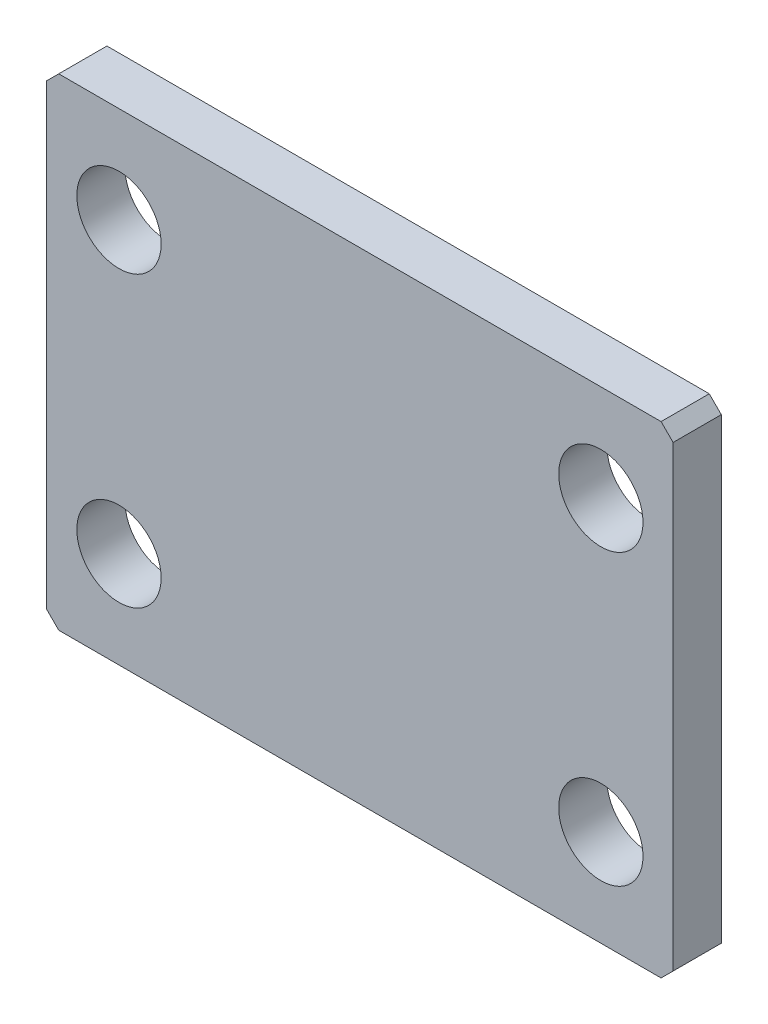
ISO-10303-21;
HEADER;
FILE_DESCRIPTION(('STEP AP214'),'2;1');
FILE_NAME('part.step','',(''),(''),'','','');
FILE_SCHEMA(('AUTOMOTIVE_DESIGN { 1 0 10303 214 1 1 1 1 }'));
ENDSEC;
DATA;
#1=APPLICATION_CONTEXT('core data for automotive mechanical design processes');
#2=APPLICATION_PROTOCOL_DEFINITION('international standard','automotive_design',2000,#1);
#3=PRODUCT_CONTEXT('',#1,'mechanical');
#4=PRODUCT('Part','Part','',(#3));
#5=PRODUCT_RELATED_PRODUCT_CATEGORY('part','',(#4));
#6=PRODUCT_DEFINITION_FORMATION('','',#4);
#7=PRODUCT_DEFINITION_CONTEXT('part definition',#1,'design');
#8=PRODUCT_DEFINITION('design','',#6,#7);
#9=PRODUCT_DEFINITION_SHAPE('','',#8);
#10=(LENGTH_UNIT() NAMED_UNIT(*) SI_UNIT(.MILLI.,.METRE.));
#11=(NAMED_UNIT(*) PLANE_ANGLE_UNIT() SI_UNIT($,.RADIAN.));
#12=(NAMED_UNIT(*) SI_UNIT($,.STERADIAN.) SOLID_ANGLE_UNIT());
#13=UNCERTAINTY_MEASURE_WITH_UNIT(LENGTH_MEASURE(1.E-05),#10,'distance_accuracy_value','');
#14=(GEOMETRIC_REPRESENTATION_CONTEXT(3) GLOBAL_UNCERTAINTY_ASSIGNED_CONTEXT((#13)) GLOBAL_UNIT_ASSIGNED_CONTEXT((#10,
#11,#12)) REPRESENTATION_CONTEXT('',''));
#15=CARTESIAN_POINT('',(0.,0.,0.));
#16=DIRECTION('',(0.,0.,1.));
#17=DIRECTION('',(1.,0.,0.));
#18=AXIS2_PLACEMENT_3D('',#15,#16,#17);
#19=CARTESIAN_POINT('',(-26.,39.,4.));
#20=DIRECTION('',(0.707106781186545,-0.70710678118655,0.));
#21=DIRECTION('',(0.70710678118655,0.707106781186545,0.));
#22=AXIS2_PLACEMENT_3D('',#19,#20,#21);
#23=PLANE('',#22);
#24=DIRECTION('',(-0.70710678118655,-0.707106781186545,0.));
#25=VECTOR('',#24,1.);
#26=CARTESIAN_POINT('',(-26.,39.,0.));
#27=LINE('',#26,#25);
#28=CARTESIAN_POINT('',(-25.,40.,0.));
#29=VERTEX_POINT('',#28);
#30=CARTESIAN_POINT('',(-26.,39.,0.));
#31=VERTEX_POINT('',#30);
#32=EDGE_CURVE('E129',#29,#31,#27,.T.);
#33=ORIENTED_EDGE('',*,*,#32,.T.);
#34=DIRECTION('',(0.,0.,-1.));
#35=VECTOR('',#34,1.);
#36=CARTESIAN_POINT('',(-26.,39.,4.));
#37=LINE('',#36,#35);
#38=CARTESIAN_POINT('',(-26.,39.,4.));
#39=VERTEX_POINT('',#38);
#40=EDGE_CURVE('E11',#39,#31,#37,.T.);
#41=ORIENTED_EDGE('',*,*,#40,.F.);
#42=DIRECTION('',(-0.70710678118655,-0.707106781186545,0.));
#43=VECTOR('',#42,1.);
#44=CARTESIAN_POINT('',(-26.,39.,4.));
#45=LINE('',#44,#43);
#46=CARTESIAN_POINT('',(-25.,40.,4.));
#47=VERTEX_POINT('',#46);
#48=EDGE_CURVE('E144',#47,#39,#45,.T.);
#49=ORIENTED_EDGE('',*,*,#48,.F.);
#50=DIRECTION('',(0.,0.,-1.));
#51=VECTOR('',#50,1.);
#52=CARTESIAN_POINT('',(-25.,40.,4.));
#53=LINE('',#52,#51);
#54=EDGE_CURVE('E125',#47,#29,#53,.T.);
#55=ORIENTED_EDGE('',*,*,#54,.T.);
#56=EDGE_LOOP('',(#33,#41,#49,#55));
#57=FACE_BOUND('',#56,.T.);
#58=ADVANCED_FACE('F33',(#57),#23,.F.);
#59=CARTESIAN_POINT('',(-26.,1.,4.));
#60=DIRECTION('',(1.,0.,0.));
#61=DIRECTION('',(0.,0.,-1.));
#62=AXIS2_PLACEMENT_3D('',#59,#60,#61);
#63=PLANE('',#62);
#64=DIRECTION('',(0.,-1.,0.));
#65=VECTOR('',#64,1.);
#66=CARTESIAN_POINT('',(-26.,1.,0.));
#67=LINE('',#66,#65);
#68=CARTESIAN_POINT('',(-26.,1.,0.));
#69=VERTEX_POINT('',#68);
#70=EDGE_CURVE('E132',#31,#69,#67,.T.);
#71=ORIENTED_EDGE('',*,*,#70,.T.);
#72=DIRECTION('',(0.,0.,-1.));
#73=VECTOR('',#72,1.);
#74=CARTESIAN_POINT('',(-26.,1.,4.));
#75=LINE('',#74,#73);
#76=CARTESIAN_POINT('',(-26.,1.,4.));
#77=VERTEX_POINT('',#76);
#78=EDGE_CURVE('E41',#77,#69,#75,.T.);
#79=ORIENTED_EDGE('',*,*,#78,.F.);
#80=DIRECTION('',(0.,-1.,0.));
#81=VECTOR('',#80,1.);
#82=CARTESIAN_POINT('',(-26.,1.,4.));
#83=LINE('',#82,#81);
#84=EDGE_CURVE('E92',#39,#77,#83,.T.);
#85=ORIENTED_EDGE('',*,*,#84,.F.);
#86=ORIENTED_EDGE('',*,*,#40,.T.);
#87=EDGE_LOOP('',(#71,#79,#85,#86));
#88=FACE_BOUND('',#87,.T.);
#89=ADVANCED_FACE('F229',(#88),#63,.F.);
#90=CARTESIAN_POINT('',(-25.,0.,4.));
#91=DIRECTION('',(0.707106781186547,0.707106781186548,0.));
#92=DIRECTION('',(-0.707106781186548,0.707106781186547,0.));
#93=AXIS2_PLACEMENT_3D('',#90,#91,#92);
#94=PLANE('',#93);
#95=DIRECTION('',(0.707106781186548,-0.707106781186547,0.));
#96=VECTOR('',#95,1.);
#97=CARTESIAN_POINT('',(-25.,0.,0.));
#98=LINE('',#97,#96);
#99=CARTESIAN_POINT('',(-25.,0.,0.));
#100=VERTEX_POINT('',#99);
#101=EDGE_CURVE('E135',#69,#100,#98,.T.);
#102=ORIENTED_EDGE('',*,*,#101,.T.);
#103=DIRECTION('',(0.,0.,-1.));
#104=VECTOR('',#103,1.);
#105=CARTESIAN_POINT('',(-25.,0.,4.));
#106=LINE('',#105,#104);
#107=CARTESIAN_POINT('',(-25.,0.,4.));
#108=VERTEX_POINT('',#107);
#109=EDGE_CURVE('E151',#108,#100,#106,.T.);
#110=ORIENTED_EDGE('',*,*,#109,.F.);
#111=DIRECTION('',(0.707106781186548,-0.707106781186547,0.));
#112=VECTOR('',#111,1.);
#113=CARTESIAN_POINT('',(-25.,0.,4.));
#114=LINE('',#113,#112);
#115=EDGE_CURVE('E159',#77,#108,#114,.T.);
#116=ORIENTED_EDGE('',*,*,#115,.F.);
#117=ORIENTED_EDGE('',*,*,#78,.T.);
#118=EDGE_LOOP('',(#102,#110,#116,#117));
#119=FACE_BOUND('',#118,.T.);
#120=ADVANCED_FACE('F157',(#119),#94,.F.);
#121=CARTESIAN_POINT('',(-25.,0.,4.));
#122=DIRECTION('',(0.,1.,0.));
#123=DIRECTION('',(0.,0.,1.));
#124=AXIS2_PLACEMENT_3D('',#121,#122,#123);
#125=PLANE('',#124);
#126=DIRECTION('',(1.,0.,0.));
#127=VECTOR('',#126,1.);
#128=CARTESIAN_POINT('',(-25.,0.,0.));
#129=LINE('',#128,#127);
#130=CARTESIAN_POINT('',(25.,0.,0.));
#131=VERTEX_POINT('',#130);
#132=EDGE_CURVE('E137',#100,#131,#129,.T.);
#133=ORIENTED_EDGE('',*,*,#132,.T.);
#134=DIRECTION('',(0.,0.,-1.));
#135=VECTOR('',#134,1.);
#136=CARTESIAN_POINT('',(25.,0.,4.));
#137=LINE('',#136,#135);
#138=CARTESIAN_POINT('',(25.,0.,4.));
#139=VERTEX_POINT('',#138);
#140=EDGE_CURVE('E148',#139,#131,#137,.T.);
#141=ORIENTED_EDGE('',*,*,#140,.F.);
#142=DIRECTION('',(1.,0.,0.));
#143=VECTOR('',#142,1.);
#144=CARTESIAN_POINT('',(-25.,0.,4.));
#145=LINE('',#144,#143);
#146=EDGE_CURVE('E171',#108,#139,#145,.T.);
#147=ORIENTED_EDGE('',*,*,#146,.F.);
#148=ORIENTED_EDGE('',*,*,#109,.T.);
#149=EDGE_LOOP('',(#133,#141,#147,#148));
#150=FACE_BOUND('',#149,.T.);
#151=ADVANCED_FACE('F167',(#150),#125,.F.);
#152=CARTESIAN_POINT('',(26.,1.,4.));
#153=DIRECTION('',(-0.707106781186557,0.707106781186538,0.));
#154=DIRECTION('',(-0.707106781186538,-0.707106781186557,0.));
#155=AXIS2_PLACEMENT_3D('',#152,#153,#154);
#156=PLANE('',#155);
#157=DIRECTION('',(0.707106781186538,0.707106781186557,0.));
#158=VECTOR('',#157,1.);
#159=CARTESIAN_POINT('',(26.,1.,0.));
#160=LINE('',#159,#158);
#161=CARTESIAN_POINT('',(26.,1.,0.));
#162=VERTEX_POINT('',#161);
#163=EDGE_CURVE('E139',#131,#162,#160,.T.);
#164=ORIENTED_EDGE('',*,*,#163,.T.);
#165=DIRECTION('',(0.,0.,-1.));
#166=VECTOR('',#165,1.);
#167=CARTESIAN_POINT('',(26.,1.,4.));
#168=LINE('',#167,#166);
#169=CARTESIAN_POINT('',(26.,1.,4.));
#170=VERTEX_POINT('',#169);
#171=EDGE_CURVE('E120',#170,#162,#168,.T.);
#172=ORIENTED_EDGE('',*,*,#171,.F.);
#173=DIRECTION('',(0.707106781186538,0.707106781186557,0.));
#174=VECTOR('',#173,1.);
#175=CARTESIAN_POINT('',(26.,1.,4.));
#176=LINE('',#175,#174);
#177=EDGE_CURVE('E111',#139,#170,#176,.T.);
#178=ORIENTED_EDGE('',*,*,#177,.F.);
#179=ORIENTED_EDGE('',*,*,#140,.T.);
#180=EDGE_LOOP('',(#164,#172,#178,#179));
#181=FACE_BOUND('',#180,.T.);
#182=ADVANCED_FACE('F170',(#181),#156,.F.);
#183=CARTESIAN_POINT('',(26.,1.,4.));
#184=DIRECTION('',(-1.,0.,0.));
#185=DIRECTION('',(0.,-1.,0.));
#186=AXIS2_PLACEMENT_3D('',#183,#184,#185);
#187=PLANE('',#186);
#188=DIRECTION('',(0.,1.,0.));
#189=VECTOR('',#188,1.);
#190=CARTESIAN_POINT('',(26.,1.,0.));
#191=LINE('',#190,#189);
#192=CARTESIAN_POINT('',(26.,39.,0.));
#193=VERTEX_POINT('',#192);
#194=EDGE_CURVE('E119',#162,#193,#191,.T.);
#195=ORIENTED_EDGE('',*,*,#194,.T.);
#196=DIRECTION('',(0.,0.,-1.));
#197=VECTOR('',#196,1.);
#198=CARTESIAN_POINT('',(26.,39.,4.));
#199=LINE('',#198,#197);
#200=CARTESIAN_POINT('',(26.,39.,4.));
#201=VERTEX_POINT('',#200);
#202=EDGE_CURVE('E116',#201,#193,#199,.T.);
#203=ORIENTED_EDGE('',*,*,#202,.F.);
#204=DIRECTION('',(0.,1.,0.));
#205=VECTOR('',#204,1.);
#206=CARTESIAN_POINT('',(26.,1.,4.));
#207=LINE('',#206,#205);
#208=EDGE_CURVE('E105',#170,#201,#207,.T.);
#209=ORIENTED_EDGE('',*,*,#208,.F.);
#210=ORIENTED_EDGE('',*,*,#171,.T.);
#211=EDGE_LOOP('',(#195,#203,#209,#210));
#212=FACE_BOUND('',#211,.T.);
#213=ADVANCED_FACE('F117',(#212),#187,.F.);
#214=CARTESIAN_POINT('',(25.,40.,4.));
#215=DIRECTION('',(-0.707106781186552,-0.707106781186543,0.));
#216=DIRECTION('',(0.707106781186543,-0.707106781186552,0.));
#217=AXIS2_PLACEMENT_3D('',#214,#215,#216);
#218=PLANE('',#217);
#219=DIRECTION('',(-0.707106781186543,0.707106781186552,0.));
#220=VECTOR('',#219,1.);
#221=CARTESIAN_POINT('',(25.,40.,0.));
#222=LINE('',#221,#220);
#223=CARTESIAN_POINT('',(25.,40.,0.));
#224=VERTEX_POINT('',#223);
#225=EDGE_CURVE('E78',#193,#224,#222,.T.);
#226=ORIENTED_EDGE('',*,*,#225,.T.);
#227=DIRECTION('',(0.,0.,-1.));
#228=VECTOR('',#227,1.);
#229=CARTESIAN_POINT('',(25.,40.,4.));
#230=LINE('',#229,#228);
#231=CARTESIAN_POINT('',(25.,40.,4.));
#232=VERTEX_POINT('',#231);
#233=EDGE_CURVE('E121',#232,#224,#230,.T.);
#234=ORIENTED_EDGE('',*,*,#233,.F.);
#235=DIRECTION('',(-0.707106781186543,0.707106781186552,0.));
#236=VECTOR('',#235,1.);
#237=CARTESIAN_POINT('',(25.,40.,4.));
#238=LINE('',#237,#236);
#239=EDGE_CURVE('E109',#201,#232,#238,.T.);
#240=ORIENTED_EDGE('',*,*,#239,.F.);
#241=ORIENTED_EDGE('',*,*,#202,.T.);
#242=EDGE_LOOP('',(#226,#234,#240,#241));
#243=FACE_BOUND('',#242,.T.);
#244=ADVANCED_FACE('F123',(#243),#218,.F.);
#245=CARTESIAN_POINT('',(-25.,40.,4.));
#246=DIRECTION('',(0.,-1.,0.));
#247=DIRECTION('',(0.,0.,-1.));
#248=AXIS2_PLACEMENT_3D('',#245,#246,#247);
#249=PLANE('',#248);
#250=DIRECTION('',(-1.,0.,0.));
#251=VECTOR('',#250,1.);
#252=CARTESIAN_POINT('',(-25.,40.,0.));
#253=LINE('',#252,#251);
#254=EDGE_CURVE('E84',#224,#29,#253,.T.);
#255=ORIENTED_EDGE('',*,*,#254,.T.);
#256=ORIENTED_EDGE('',*,*,#54,.F.);
#257=DIRECTION('',(-1.,0.,0.));
#258=VECTOR('',#257,1.);
#259=CARTESIAN_POINT('',(-25.,40.,4.));
#260=LINE('',#259,#258);
#261=EDGE_CURVE('E49',#232,#47,#260,.T.);
#262=ORIENTED_EDGE('',*,*,#261,.F.);
#263=ORIENTED_EDGE('',*,*,#233,.T.);
#264=EDGE_LOOP('',(#255,#256,#262,#263));
#265=FACE_BOUND('',#264,.T.);
#266=ADVANCED_FACE('F213',(#265),#249,.F.);
#267=CARTESIAN_POINT('',(0.,0.,4.));
#268=DIRECTION('',(0.,0.,-1.));
#269=DIRECTION('',(-1.,0.,0.));
#270=AXIS2_PLACEMENT_3D('',#267,#268,#269);
#271=PLANE('',#270);
#272=CARTESIAN_POINT('',(-20.,32.,4.));
#273=DIRECTION('',(0.,0.,1.));
#274=DIRECTION('',(1.,0.,0.));
#275=AXIS2_PLACEMENT_3D('',#272,#273,#274);
#276=CIRCLE('',#275,3.5);
#277=CARTESIAN_POINT('',(-16.5,32.,4.));
#278=VERTEX_POINT('',#277);
#279=EDGE_CURVE('E190',#278,#278,#276,.T.);
#280=ORIENTED_EDGE('',*,*,#279,.F.);
#281=EDGE_LOOP('',(#280));
#282=FACE_BOUND('',#281,.T.);
#283=CARTESIAN_POINT('',(20.,8.,4.));
#284=DIRECTION('',(0.,0.,1.));
#285=DIRECTION('',(1.,0.,0.));
#286=AXIS2_PLACEMENT_3D('',#283,#284,#285);
#287=CIRCLE('',#286,3.5);
#288=CARTESIAN_POINT('',(23.5,8.,4.));
#289=VERTEX_POINT('',#288);
#290=EDGE_CURVE('E183',#289,#289,#287,.T.);
#291=ORIENTED_EDGE('',*,*,#290,.F.);
#292=EDGE_LOOP('',(#291));
#293=FACE_BOUND('',#292,.T.);
#294=CARTESIAN_POINT('',(-20.,8.,4.));
#295=DIRECTION('',(0.,0.,1.));
#296=DIRECTION('',(1.,0.,0.));
#297=AXIS2_PLACEMENT_3D('',#294,#295,#296);
#298=CIRCLE('',#297,3.5);
#299=CARTESIAN_POINT('',(-16.5,8.,4.));
#300=VERTEX_POINT('',#299);
#301=EDGE_CURVE('E195',#300,#300,#298,.T.);
#302=ORIENTED_EDGE('',*,*,#301,.F.);
#303=EDGE_LOOP('',(#302));
#304=FACE_BOUND('',#303,.T.);
#305=CARTESIAN_POINT('',(20.,32.,4.));
#306=DIRECTION('',(0.,0.,1.));
#307=DIRECTION('',(1.,0.,0.));
#308=AXIS2_PLACEMENT_3D('',#305,#306,#307);
#309=CIRCLE('',#308,3.5);
#310=CARTESIAN_POINT('',(23.5,32.,4.));
#311=VERTEX_POINT('',#310);
#312=EDGE_CURVE('E177',#311,#311,#309,.T.);
#313=ORIENTED_EDGE('',*,*,#312,.F.);
#314=EDGE_LOOP('',(#313));
#315=FACE_BOUND('',#314,.T.);
#316=ORIENTED_EDGE('',*,*,#48,.T.);
#317=ORIENTED_EDGE('',*,*,#84,.T.);
#318=ORIENTED_EDGE('',*,*,#115,.T.);
#319=ORIENTED_EDGE('',*,*,#146,.T.);
#320=ORIENTED_EDGE('',*,*,#177,.T.);
#321=ORIENTED_EDGE('',*,*,#208,.T.);
#322=ORIENTED_EDGE('',*,*,#239,.T.);
#323=ORIENTED_EDGE('',*,*,#261,.T.);
#324=EDGE_LOOP('',(#316,#317,#318,#319,#320,#321,#322,#323));
#325=FACE_BOUND('',#324,.T.);
#326=ADVANCED_FACE('F107',(#282,#293,#304,#315,#325),#271,.F.);
#327=CARTESIAN_POINT('',(0.,0.,0.));
#328=DIRECTION('',(0.,0.,-1.));
#329=DIRECTION('',(-1.,0.,0.));
#330=AXIS2_PLACEMENT_3D('',#327,#328,#329);
#331=PLANE('',#330);
#332=CARTESIAN_POINT('',(-20.,32.,0.));
#333=DIRECTION('',(0.,0.,1.));
#334=DIRECTION('',(1.,0.,0.));
#335=AXIS2_PLACEMENT_3D('',#332,#333,#334);
#336=CIRCLE('',#335,3.5);
#337=CARTESIAN_POINT('',(-16.5,32.,0.));
#338=VERTEX_POINT('',#337);
#339=EDGE_CURVE('E180',#338,#338,#336,.T.);
#340=ORIENTED_EDGE('',*,*,#339,.T.);
#341=EDGE_LOOP('',(#340));
#342=FACE_BOUND('',#341,.T.);
#343=CARTESIAN_POINT('',(20.,8.,0.));
#344=DIRECTION('',(0.,0.,1.));
#345=DIRECTION('',(1.,0.,0.));
#346=AXIS2_PLACEMENT_3D('',#343,#344,#345);
#347=CIRCLE('',#346,3.5);
#348=CARTESIAN_POINT('',(23.5,8.,0.));
#349=VERTEX_POINT('',#348);
#350=EDGE_CURVE('E186',#349,#349,#347,.T.);
#351=ORIENTED_EDGE('',*,*,#350,.T.);
#352=EDGE_LOOP('',(#351));
#353=FACE_BOUND('',#352,.T.);
#354=CARTESIAN_POINT('',(-20.,8.,0.));
#355=DIRECTION('',(0.,0.,1.));
#356=DIRECTION('',(1.,0.,0.));
#357=AXIS2_PLACEMENT_3D('',#354,#355,#356);
#358=CIRCLE('',#357,3.5);
#359=CARTESIAN_POINT('',(-16.5,8.,0.));
#360=VERTEX_POINT('',#359);
#361=EDGE_CURVE('E187',#360,#360,#358,.T.);
#362=ORIENTED_EDGE('',*,*,#361,.T.);
#363=EDGE_LOOP('',(#362));
#364=FACE_BOUND('',#363,.T.);
#365=CARTESIAN_POINT('',(20.,32.,0.));
#366=DIRECTION('',(0.,0.,1.));
#367=DIRECTION('',(1.,0.,0.));
#368=AXIS2_PLACEMENT_3D('',#365,#366,#367);
#369=CIRCLE('',#368,3.5);
#370=CARTESIAN_POINT('',(23.5,32.,0.));
#371=VERTEX_POINT('',#370);
#372=EDGE_CURVE('E133',#371,#371,#369,.T.);
#373=ORIENTED_EDGE('',*,*,#372,.T.);
#374=EDGE_LOOP('',(#373));
#375=FACE_BOUND('',#374,.T.);
#376=ORIENTED_EDGE('',*,*,#32,.F.);
#377=ORIENTED_EDGE('',*,*,#254,.F.);
#378=ORIENTED_EDGE('',*,*,#225,.F.);
#379=ORIENTED_EDGE('',*,*,#194,.F.);
#380=ORIENTED_EDGE('',*,*,#163,.F.);
#381=ORIENTED_EDGE('',*,*,#132,.F.);
#382=ORIENTED_EDGE('',*,*,#101,.F.);
#383=ORIENTED_EDGE('',*,*,#70,.F.);
#384=EDGE_LOOP('',(#376,#377,#378,#379,#380,#381,#382,#383));
#385=FACE_BOUND('',#384,.T.);
#386=ADVANCED_FACE('F163',(#342,#353,#364,#375,#385),#331,.T.);
#387=CARTESIAN_POINT('',(20.,32.,0.));
#388=DIRECTION('',(0.,0.,1.));
#389=DIRECTION('',(1.,0.,0.));
#390=AXIS2_PLACEMENT_3D('',#387,#388,#389);
#391=CYLINDRICAL_SURFACE('',#390,3.5);
#392=ORIENTED_EDGE('',*,*,#372,.F.);
#393=EDGE_LOOP('',(#392));
#394=FACE_BOUND('',#393,.T.);
#395=ORIENTED_EDGE('',*,*,#312,.T.);
#396=EDGE_LOOP('',(#395));
#397=FACE_BOUND('',#396,.T.);
#398=ADVANCED_FACE('F207',(#394,#397),#391,.F.);
#399=CARTESIAN_POINT('',(-20.,8.,0.));
#400=DIRECTION('',(0.,0.,1.));
#401=DIRECTION('',(1.,0.,0.));
#402=AXIS2_PLACEMENT_3D('',#399,#400,#401);
#403=CYLINDRICAL_SURFACE('',#402,3.5);
#404=ORIENTED_EDGE('',*,*,#361,.F.);
#405=EDGE_LOOP('',(#404));
#406=FACE_BOUND('',#405,.T.);
#407=ORIENTED_EDGE('',*,*,#301,.T.);
#408=EDGE_LOOP('',(#407));
#409=FACE_BOUND('',#408,.T.);
#410=ADVANCED_FACE('F203',(#406,#409),#403,.F.);
#411=CARTESIAN_POINT('',(20.,8.,0.));
#412=DIRECTION('',(0.,0.,1.));
#413=DIRECTION('',(1.,0.,0.));
#414=AXIS2_PLACEMENT_3D('',#411,#412,#413);
#415=CYLINDRICAL_SURFACE('',#414,3.5);
#416=ORIENTED_EDGE('',*,*,#350,.F.);
#417=EDGE_LOOP('',(#416));
#418=FACE_BOUND('',#417,.T.);
#419=ORIENTED_EDGE('',*,*,#290,.T.);
#420=EDGE_LOOP('',(#419));
#421=FACE_BOUND('',#420,.T.);
#422=ADVANCED_FACE('F206',(#418,#421),#415,.F.);
#423=CARTESIAN_POINT('',(-20.,32.,0.));
#424=DIRECTION('',(0.,0.,1.));
#425=DIRECTION('',(1.,0.,0.));
#426=AXIS2_PLACEMENT_3D('',#423,#424,#425);
#427=CYLINDRICAL_SURFACE('',#426,3.5);
#428=ORIENTED_EDGE('',*,*,#339,.F.);
#429=EDGE_LOOP('',(#428));
#430=FACE_BOUND('',#429,.T.);
#431=ORIENTED_EDGE('',*,*,#279,.T.);
#432=EDGE_LOOP('',(#431));
#433=FACE_BOUND('',#432,.T.);
#434=ADVANCED_FACE('F305',(#430,#433),#427,.F.);
#435=CLOSED_SHELL('',(#58,#89,#120,#151,#182,#213,#244,#266,#326,#386,#398,#410,#422,#434));
#436=MANIFOLD_SOLID_BREP('B2',#435);
#437=ADVANCED_BREP_SHAPE_REPRESENTATION('',(#18,#436),#14);
#438=SHAPE_DEFINITION_REPRESENTATION(#9,#437);
ENDSEC;
END-ISO-10303-21;
